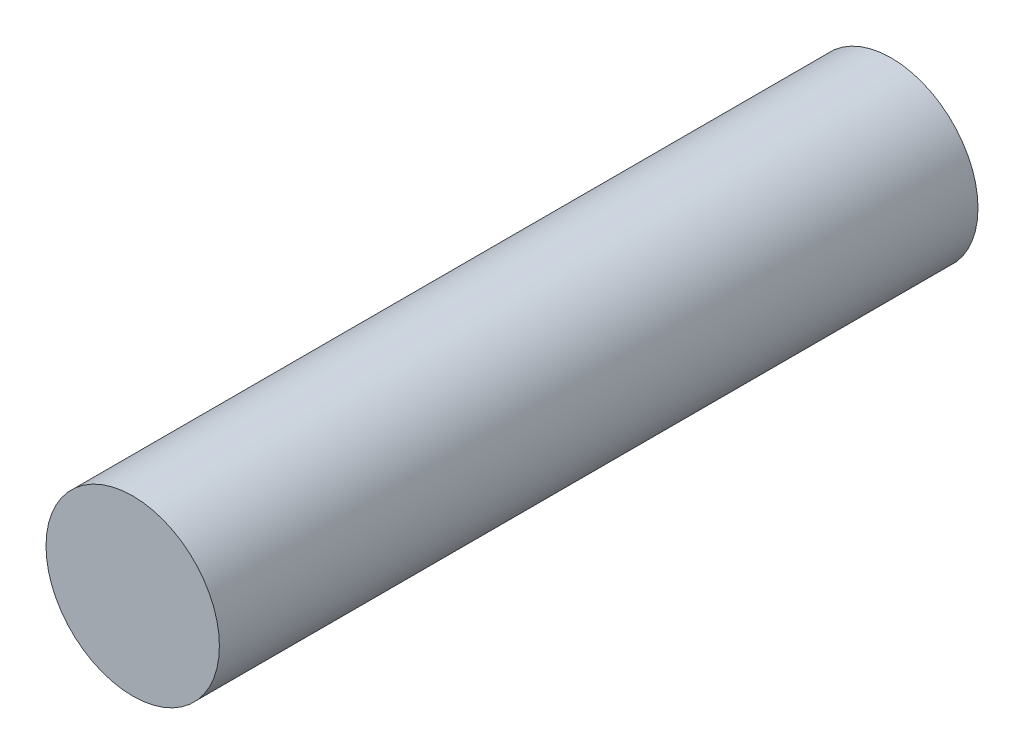
ISO-10303-21;
HEADER;
FILE_DESCRIPTION(('STEP AP214'),'2;1');
FILE_NAME('part.step','',(''),(''),'','','');
FILE_SCHEMA(('AUTOMOTIVE_DESIGN { 1 0 10303 214 1 1 1 1 }'));
ENDSEC;
DATA;
#1=APPLICATION_CONTEXT('core data for automotive mechanical design processes');
#2=APPLICATION_PROTOCOL_DEFINITION('international standard','automotive_design',2000,#1);
#3=PRODUCT_CONTEXT('',#1,'mechanical');
#4=PRODUCT('Part','Part','',(#3));
#5=PRODUCT_RELATED_PRODUCT_CATEGORY('part','',(#4));
#6=PRODUCT_DEFINITION_FORMATION('','',#4);
#7=PRODUCT_DEFINITION_CONTEXT('part definition',#1,'design');
#8=PRODUCT_DEFINITION('design','',#6,#7);
#9=PRODUCT_DEFINITION_SHAPE('','',#8);
#10=(LENGTH_UNIT() NAMED_UNIT(*) SI_UNIT(.MILLI.,.METRE.));
#11=(NAMED_UNIT(*) PLANE_ANGLE_UNIT() SI_UNIT($,.RADIAN.));
#12=(NAMED_UNIT(*) SI_UNIT($,.STERADIAN.) SOLID_ANGLE_UNIT());
#13=UNCERTAINTY_MEASURE_WITH_UNIT(LENGTH_MEASURE(1.E-05),#10,'distance_accuracy_value','');
#14=(GEOMETRIC_REPRESENTATION_CONTEXT(3) GLOBAL_UNCERTAINTY_ASSIGNED_CONTEXT((#13)) GLOBAL_UNIT_ASSIGNED_CONTEXT((#10,
#11,#12)) REPRESENTATION_CONTEXT('',''));
#15=CARTESIAN_POINT('',(0.,0.,0.));
#16=DIRECTION('',(0.,0.,1.));
#17=DIRECTION('',(1.,0.,0.));
#18=AXIS2_PLACEMENT_3D('',#15,#16,#17);
#19=CARTESIAN_POINT('',(-2.96761038706161,0.421327400632205,35.));
#20=DIRECTION('',(0.,0.,-1.));
#21=DIRECTION('',(-1.,0.,0.));
#22=AXIS2_PLACEMENT_3D('',#19,#20,#21);
#23=CYLINDRICAL_SURFACE('',#22,4.);
#24=CARTESIAN_POINT('',(-2.96761038706161,0.421327400632205,35.));
#25=DIRECTION('',(0.,0.,1.));
#26=DIRECTION('',(1.,0.,0.));
#27=AXIS2_PLACEMENT_3D('',#24,#25,#26);
#28=CIRCLE('',#27,4.);
#29=CARTESIAN_POINT('',(1.03238961293839,0.421327400632205,35.));
#30=VERTEX_POINT('',#29);
#31=EDGE_CURVE('E10',#30,#30,#28,.T.);
#32=ORIENTED_EDGE('',*,*,#31,.F.);
#33=EDGE_LOOP('',(#32));
#34=FACE_BOUND('',#33,.T.);
#35=CARTESIAN_POINT('',(-2.96761038706161,0.421327400632205,0.));
#36=DIRECTION('',(0.,0.,1.));
#37=DIRECTION('',(1.,0.,0.));
#38=AXIS2_PLACEMENT_3D('',#35,#36,#37);
#39=CIRCLE('',#38,4.);
#40=CARTESIAN_POINT('',(1.03238961293839,0.421327400632205,0.));
#41=VERTEX_POINT('',#40);
#42=EDGE_CURVE('E36',#41,#41,#39,.T.);
#43=ORIENTED_EDGE('',*,*,#42,.T.);
#44=EDGE_LOOP('',(#43));
#45=FACE_BOUND('',#44,.T.);
#46=ADVANCED_FACE('F33',(#34,#45),#23,.T.);
#47=CARTESIAN_POINT('',(-2.96761038706161,0.421327400632205,35.));
#48=DIRECTION('',(0.,0.,1.));
#49=DIRECTION('',(1.,0.,0.));
#50=AXIS2_PLACEMENT_3D('',#47,#48,#49);
#51=PLANE('',#50);
#52=ORIENTED_EDGE('',*,*,#31,.T.);
#53=EDGE_LOOP('',(#52));
#54=FACE_BOUND('',#53,.T.);
#55=ADVANCED_FACE('F48',(#54),#51,.T.);
#56=CARTESIAN_POINT('',(-2.96761038706161,0.421327400632205,0.));
#57=DIRECTION('',(0.,0.,1.));
#58=DIRECTION('',(1.,0.,0.));
#59=AXIS2_PLACEMENT_3D('',#56,#57,#58);
#60=PLANE('',#59);
#61=ORIENTED_EDGE('',*,*,#42,.F.);
#62=EDGE_LOOP('',(#61));
#63=FACE_BOUND('',#62,.T.);
#64=ADVANCED_FACE('F46',(#63),#60,.F.);
#65=CLOSED_SHELL('',(#46,#55,#64));
#66=MANIFOLD_SOLID_BREP('B2',#65);
#67=ADVANCED_BREP_SHAPE_REPRESENTATION('',(#18,#66),#14);
#68=SHAPE_DEFINITION_REPRESENTATION(#9,#67);
ENDSEC;
END-ISO-10303-21;
